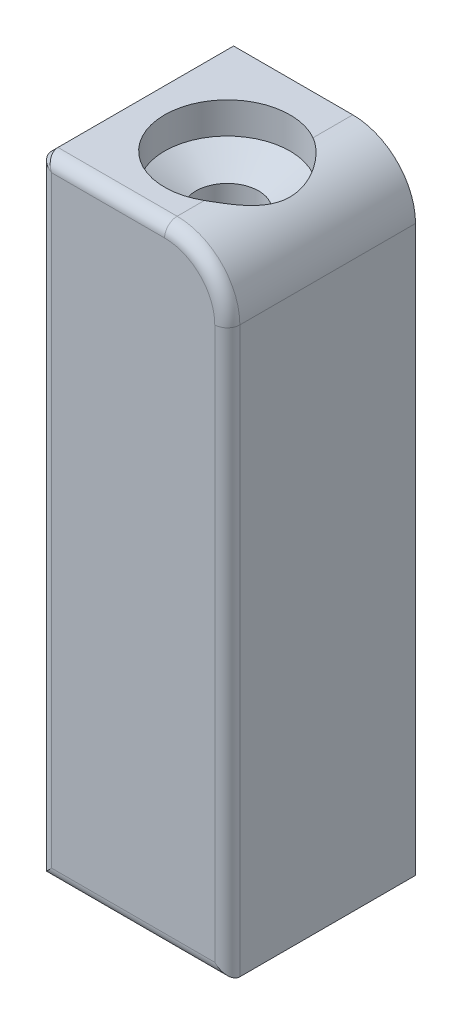
ISO-10303-21;
HEADER;
FILE_DESCRIPTION(('STEP AP214'),'2;1');
FILE_NAME('part.step','',(''),(''),'','','');
FILE_SCHEMA(('AUTOMOTIVE_DESIGN { 1 0 10303 214 1 1 1 1 }'));
ENDSEC;
DATA;
#1=APPLICATION_CONTEXT('core data for automotive mechanical design processes');
#2=APPLICATION_PROTOCOL_DEFINITION('international standard','automotive_design',2000,#1);
#3=PRODUCT_CONTEXT('',#1,'mechanical');
#4=PRODUCT('Part','Part','',(#3));
#5=PRODUCT_RELATED_PRODUCT_CATEGORY('part','',(#4));
#6=PRODUCT_DEFINITION_FORMATION('','',#4);
#7=PRODUCT_DEFINITION_CONTEXT('part definition',#1,'design');
#8=PRODUCT_DEFINITION('design','',#6,#7);
#9=PRODUCT_DEFINITION_SHAPE('','',#8);
#10=(LENGTH_UNIT() NAMED_UNIT(*) SI_UNIT(.MILLI.,.METRE.));
#11=(NAMED_UNIT(*) PLANE_ANGLE_UNIT() SI_UNIT($,.RADIAN.));
#12=(NAMED_UNIT(*) SI_UNIT($,.STERADIAN.) SOLID_ANGLE_UNIT());
#13=UNCERTAINTY_MEASURE_WITH_UNIT(LENGTH_MEASURE(1.E-05),#10,'distance_accuracy_value','');
#14=(GEOMETRIC_REPRESENTATION_CONTEXT(3) GLOBAL_UNCERTAINTY_ASSIGNED_CONTEXT((#13)) GLOBAL_UNIT_ASSIGNED_CONTEXT((#10,
#11,#12)) REPRESENTATION_CONTEXT('',''));
#15=CARTESIAN_POINT('',(0.,0.,0.));
#16=DIRECTION('',(0.,0.,1.));
#17=DIRECTION('',(1.,0.,0.));
#18=AXIS2_PLACEMENT_3D('',#15,#16,#17);
#19=CARTESIAN_POINT('',(15.,100.,-15.));
#20=DIRECTION('',(-1.,0.,0.));
#21=DIRECTION('',(0.,0.,1.));
#22=AXIS2_PLACEMENT_3D('',#19,#20,#21);
#23=PLANE('',#22);
#24=DIRECTION('',(0.,0.,-1.));
#25=VECTOR('',#24,1.);
#26=CARTESIAN_POINT('',(15.,90.,15.));
#27=LINE('',#26,#25);
#28=CARTESIAN_POINT('',(15.,90.,-15.));
#29=VERTEX_POINT('',#28);
#30=CARTESIAN_POINT('',(15.,90.,13.));
#31=VERTEX_POINT('',#30);
#32=EDGE_CURVE('E479',#29,#31,#27,.F.);
#33=ORIENTED_EDGE('',*,*,#32,.T.);
#34=DIRECTION('',(0.,-1.,0.));
#35=VECTOR('',#34,1.);
#36=CARTESIAN_POINT('',(15.,100.,13.));
#37=LINE('',#36,#35);
#38=CARTESIAN_POINT('',(15.,0.,13.));
#39=VERTEX_POINT('',#38);
#40=EDGE_CURVE('E125',#31,#39,#37,.T.);
#41=ORIENTED_EDGE('',*,*,#40,.T.);
#42=DIRECTION('',(0.,0.,-1.));
#43=VECTOR('',#42,1.);
#44=CARTESIAN_POINT('',(15.,0.,-15.));
#45=LINE('',#44,#43);
#46=CARTESIAN_POINT('',(15.,0.,-15.));
#47=VERTEX_POINT('',#46);
#48=EDGE_CURVE('E119',#39,#47,#45,.T.);
#49=ORIENTED_EDGE('',*,*,#48,.T.);
#50=DIRECTION('',(0.,-1.,0.));
#51=VECTOR('',#50,1.);
#52=CARTESIAN_POINT('',(15.,100.,-15.));
#53=LINE('',#52,#51);
#54=EDGE_CURVE('E122',#29,#47,#53,.T.);
#55=ORIENTED_EDGE('',*,*,#54,.F.);
#56=EDGE_LOOP('',(#33,#41,#49,#55));
#57=FACE_BOUND('',#56,.T.);
#58=ADVANCED_FACE('F41',(#57),#23,.F.);
#59=CARTESIAN_POINT('',(-15.,100.,-15.));
#60=DIRECTION('',(0.,0.,1.));
#61=DIRECTION('',(1.,0.,0.));
#62=AXIS2_PLACEMENT_3D('',#59,#60,#61);
#63=PLANE('',#62);
#64=DIRECTION('',(0.,-1.,0.));
#65=VECTOR('',#64,1.);
#66=CARTESIAN_POINT('',(-15.,100.,-15.));
#67=LINE('',#66,#65);
#68=CARTESIAN_POINT('',(-15.,99.,-15.));
#69=VERTEX_POINT('',#68);
#70=CARTESIAN_POINT('',(-15.,0.,-15.));
#71=VERTEX_POINT('',#70);
#72=EDGE_CURVE('E139',#69,#71,#67,.T.);
#73=ORIENTED_EDGE('',*,*,#72,.F.);
#74=DIRECTION('',(0.707106781186548,0.707106781186548,0.));
#75=VECTOR('',#74,1.);
#76=CARTESIAN_POINT('',(-14.,100.,-15.));
#77=LINE('',#76,#75);
#78=CARTESIAN_POINT('',(-14.,100.,-15.));
#79=VERTEX_POINT('',#78);
#80=EDGE_CURVE('E11',#69,#79,#77,.T.);
#81=ORIENTED_EDGE('',*,*,#80,.T.);
#82=DIRECTION('',(-1.,0.,0.));
#83=VECTOR('',#82,1.);
#84=CARTESIAN_POINT('',(-15.,100.,-15.));
#85=LINE('',#84,#83);
#86=CARTESIAN_POINT('',(4.99999999999998,100.,-15.));
#87=VERTEX_POINT('',#86);
#88=EDGE_CURVE('E145',#87,#79,#85,.T.);
#89=ORIENTED_EDGE('',*,*,#88,.F.);
#90=CARTESIAN_POINT('',(4.99999999999998,90.,-15.));
#91=DIRECTION('',(0.,0.,1.));
#92=DIRECTION('',(1.,0.,0.));
#93=AXIS2_PLACEMENT_3D('',#90,#91,#92);
#94=CIRCLE('',#93,10.);
#95=EDGE_CURVE('E137',#87,#29,#94,.F.);
#96=ORIENTED_EDGE('',*,*,#95,.T.);
#97=ORIENTED_EDGE('',*,*,#54,.T.);
#98=DIRECTION('',(-1.,0.,0.));
#99=VECTOR('',#98,1.);
#100=CARTESIAN_POINT('',(-15.,0.,-15.));
#101=LINE('',#100,#99);
#102=EDGE_CURVE('E130',#47,#71,#101,.T.);
#103=ORIENTED_EDGE('',*,*,#102,.T.);
#104=EDGE_LOOP('',(#73,#81,#89,#96,#97,#103));
#105=FACE_BOUND('',#104,.T.);
#106=ADVANCED_FACE('F134',(#105),#63,.F.);
#107=CARTESIAN_POINT('',(-15.,100.,-15.));
#108=DIRECTION('',(1.,0.,0.));
#109=DIRECTION('',(0.,0.,-1.));
#110=AXIS2_PLACEMENT_3D('',#107,#108,#109);
#111=PLANE('',#110);
#112=DIRECTION('',(0.,-1.,0.));
#113=VECTOR('',#112,1.);
#114=CARTESIAN_POINT('',(-15.,100.,13.));
#115=LINE('',#114,#113);
#116=CARTESIAN_POINT('',(-15.,0.,13.));
#117=VERTEX_POINT('',#116);
#118=CARTESIAN_POINT('',(-15.,99.,13.));
#119=VERTEX_POINT('',#118);
#120=EDGE_CURVE('E423',#117,#119,#115,.F.);
#121=ORIENTED_EDGE('',*,*,#120,.T.);
#122=DIRECTION('',(0.,0.,-1.));
#123=VECTOR('',#122,1.);
#124=CARTESIAN_POINT('',(-15.,99.,-15.));
#125=LINE('',#124,#123);
#126=EDGE_CURVE('E53',#119,#69,#125,.T.);
#127=ORIENTED_EDGE('',*,*,#126,.T.);
#128=ORIENTED_EDGE('',*,*,#72,.T.);
#129=DIRECTION('',(0.,0.,1.));
#130=VECTOR('',#129,1.);
#131=CARTESIAN_POINT('',(-15.,0.,-15.));
#132=LINE('',#131,#130);
#133=EDGE_CURVE('E143',#71,#117,#132,.T.);
#134=ORIENTED_EDGE('',*,*,#133,.T.);
#135=EDGE_LOOP('',(#121,#127,#128,#134));
#136=FACE_BOUND('',#135,.T.);
#137=ADVANCED_FACE('F187',(#136),#111,.F.);
#138=CARTESIAN_POINT('',(-15.,100.,15.));
#139=DIRECTION('',(0.,0.,-1.));
#140=DIRECTION('',(-1.,0.,0.));
#141=AXIS2_PLACEMENT_3D('',#138,#139,#140);
#142=PLANE('',#141);
#143=DIRECTION('',(0.,-1.,0.));
#144=VECTOR('',#143,1.);
#145=CARTESIAN_POINT('',(-13.,100.,15.));
#146=LINE('',#145,#144);
#147=CARTESIAN_POINT('',(-13.,98.,15.));
#148=VERTEX_POINT('',#147);
#149=CARTESIAN_POINT('',(-13.,2.,15.));
#150=VERTEX_POINT('',#149);
#151=EDGE_CURVE('E462',#148,#150,#146,.T.);
#152=ORIENTED_EDGE('',*,*,#151,.T.);
#153=DIRECTION('',(1.,0.,0.));
#154=VECTOR('',#153,1.);
#155=CARTESIAN_POINT('',(-15.,2.,15.));
#156=LINE('',#155,#154);
#157=CARTESIAN_POINT('',(13.,2.,15.));
#158=VERTEX_POINT('',#157);
#159=EDGE_CURVE('E464',#150,#158,#156,.T.);
#160=ORIENTED_EDGE('',*,*,#159,.T.);
#161=DIRECTION('',(0.,-1.,0.));
#162=VECTOR('',#161,1.);
#163=CARTESIAN_POINT('',(13.,100.,15.));
#164=LINE('',#163,#162);
#165=CARTESIAN_POINT('',(13.,90.,15.));
#166=VERTEX_POINT('',#165);
#167=EDGE_CURVE('E477',#158,#166,#164,.F.);
#168=ORIENTED_EDGE('',*,*,#167,.T.);
#169=CARTESIAN_POINT('',(4.99999999999999,90.,15.));
#170=DIRECTION('',(0.,0.,-1.));
#171=DIRECTION('',(-1.,0.,0.));
#172=AXIS2_PLACEMENT_3D('',#169,#170,#171);
#173=CIRCLE('',#172,8.);
#174=CARTESIAN_POINT('',(4.99999999999999,98.,15.));
#175=VERTEX_POINT('',#174);
#176=EDGE_CURVE('E465',#166,#175,#173,.F.);
#177=ORIENTED_EDGE('',*,*,#176,.T.);
#178=DIRECTION('',(1.,0.,0.));
#179=VECTOR('',#178,1.);
#180=CARTESIAN_POINT('',(-15.,98.,15.));
#181=LINE('',#180,#179);
#182=EDGE_CURVE('E456',#175,#148,#181,.F.);
#183=ORIENTED_EDGE('',*,*,#182,.T.);
#184=EDGE_LOOP('',(#152,#160,#168,#177,#183));
#185=FACE_BOUND('',#184,.T.);
#186=ADVANCED_FACE('F180',(#185),#142,.F.);
#187=CARTESIAN_POINT('',(0.,100.,0.));
#188=DIRECTION('',(0.,1.,0.));
#189=DIRECTION('',(0.,0.,1.));
#190=AXIS2_PLACEMENT_3D('',#187,#188,#189);
#191=PLANE('',#190);
#192=ORIENTED_EDGE('',*,*,#88,.T.);
#193=DIRECTION('',(0.,0.,1.));
#194=VECTOR('',#193,1.);
#195=CARTESIAN_POINT('',(-14.,100.,13.));
#196=LINE('',#195,#194);
#197=CARTESIAN_POINT('',(-14.,100.,13.));
#198=VERTEX_POINT('',#197);
#199=EDGE_CURVE('E397',#79,#198,#196,.T.);
#200=ORIENTED_EDGE('',*,*,#199,.T.);
#201=DIRECTION('',(1.,0.,0.));
#202=VECTOR('',#201,1.);
#203=CARTESIAN_POINT('',(4.99999999999998,100.,13.));
#204=LINE('',#203,#202);
#205=CARTESIAN_POINT('',(4.99999999999998,100.,13.));
#206=VERTEX_POINT('',#205);
#207=EDGE_CURVE('E426',#198,#206,#204,.T.);
#208=ORIENTED_EDGE('',*,*,#207,.T.);
#209=DIRECTION('',(0.,0.,-1.));
#210=VECTOR('',#209,1.);
#211=CARTESIAN_POINT('',(4.99999999999998,100.,-15.));
#212=LINE('',#211,#210);
#213=CARTESIAN_POINT('',(4.99999999999998,100.,8.66025403784441));
#214=VERTEX_POINT('',#213);
#215=EDGE_CURVE('E151',#206,#214,#212,.T.);
#216=ORIENTED_EDGE('',*,*,#215,.T.);
#217=CARTESIAN_POINT('',(0.,100.,0.));
#218=DIRECTION('',(0.,1.,0.));
#219=DIRECTION('',(-1.,0.,0.));
#220=AXIS2_PLACEMENT_3D('',#217,#218,#219);
#221=CIRCLE('',#220,10.);
#222=CARTESIAN_POINT('',(4.99999999999998,100.,-8.66025403784441));
#223=VERTEX_POINT('',#222);
#224=EDGE_CURVE('E485',#223,#214,#221,.T.);
#225=ORIENTED_EDGE('',*,*,#224,.F.);
#226=DIRECTION('',(0.,0.,-1.));
#227=VECTOR('',#226,1.);
#228=CARTESIAN_POINT('',(4.99999999999998,100.,-15.));
#229=LINE('',#228,#227);
#230=EDGE_CURVE('E138',#223,#87,#229,.T.);
#231=ORIENTED_EDGE('',*,*,#230,.T.);
#232=EDGE_LOOP('',(#192,#200,#208,#216,#225,#231));
#233=FACE_BOUND('',#232,.T.);
#234=ADVANCED_FACE('F177',(#233),#191,.T.);
#235=CARTESIAN_POINT('',(0.,0.,0.));
#236=DIRECTION('',(0.,1.,0.));
#237=DIRECTION('',(0.,0.,1.));
#238=AXIS2_PLACEMENT_3D('',#235,#236,#237);
#239=PLANE('',#238);
#240=CARTESIAN_POINT('',(0.,0.,0.));
#241=DIRECTION('',(0.,1.,0.));
#242=DIRECTION('',(-1.,0.,0.));
#243=AXIS2_PLACEMENT_3D('',#240,#241,#242);
#244=CIRCLE('',#243,5.);
#245=CARTESIAN_POINT('',(-5.,0.,0.));
#246=VERTEX_POINT('',#245);
#247=EDGE_CURVE('E490',#246,#246,#244,.T.);
#248=ORIENTED_EDGE('',*,*,#247,.T.);
#249=EDGE_LOOP('',(#248));
#250=FACE_BOUND('',#249,.T.);
#251=ORIENTED_EDGE('',*,*,#48,.F.);
#252=DIRECTION('',(1.,0.,0.));
#253=VECTOR('',#252,1.);
#254=CARTESIAN_POINT('',(0.,0.,13.));
#255=LINE('',#254,#253);
#256=EDGE_CURVE('E427',#39,#117,#255,.F.);
#257=ORIENTED_EDGE('',*,*,#256,.T.);
#258=ORIENTED_EDGE('',*,*,#133,.F.);
#259=ORIENTED_EDGE('',*,*,#102,.F.);
#260=EDGE_LOOP('',(#251,#257,#258,#259));
#261=FACE_BOUND('',#260,.T.);
#262=ADVANCED_FACE('F141',(#250,#261),#239,.F.);
#263=CARTESIAN_POINT('',(0.,95.,0.));
#264=DIRECTION('',(0.,1.,0.));
#265=DIRECTION('',(-1.,0.,0.));
#266=AXIS2_PLACEMENT_3D('',#263,#264,#265);
#267=CONICAL_SURFACE('',#266,10.,1.03037682652431);
#268=CARTESIAN_POINT('',(0.,92.,0.));
#269=DIRECTION('',(0.,1.,0.));
#270=DIRECTION('',(-1.,0.,0.));
#271=AXIS2_PLACEMENT_3D('',#268,#269,#270);
#272=CIRCLE('',#271,5.00000000000002);
#273=CARTESIAN_POINT('',(-5.00000000000001,92.,0.));
#274=VERTEX_POINT('',#273);
#275=EDGE_CURVE('E422',#274,#274,#272,.T.);
#276=ORIENTED_EDGE('',*,*,#275,.F.);
#277=EDGE_LOOP('',(#276));
#278=FACE_BOUND('',#277,.T.);
#279=CARTESIAN_POINT('',(0.,95.,0.));
#280=DIRECTION('',(0.,1.,0.));
#281=DIRECTION('',(-1.,0.,0.));
#282=AXIS2_PLACEMENT_3D('',#279,#280,#281);
#283=CIRCLE('',#282,10.);
#284=CARTESIAN_POINT('',(-10.,95.,0.));
#285=VERTEX_POINT('',#284);
#286=EDGE_CURVE('E131',#285,#285,#283,.T.);
#287=ORIENTED_EDGE('',*,*,#286,.T.);
#288=EDGE_LOOP('',(#287));
#289=FACE_BOUND('',#288,.T.);
#290=ADVANCED_FACE('F172',(#278,#289),#267,.F.);
#291=CARTESIAN_POINT('',(0.,100.,0.));
#292=DIRECTION('',(0.,1.,0.));
#293=DIRECTION('',(-1.,0.,0.));
#294=AXIS2_PLACEMENT_3D('',#291,#292,#293);
#295=CYLINDRICAL_SURFACE('',#294,10.);
#296=ORIENTED_EDGE('',*,*,#286,.F.);
#297=EDGE_LOOP('',(#296));
#298=FACE_BOUND('',#297,.T.);
#299=ORIENTED_EDGE('',*,*,#224,.T.);
#300=CARTESIAN_POINT('',(4.99999999999998,100.,8.66025403784441));
#301=CARTESIAN_POINT('',(5.1157847617349,100.000001131384,8.59340770325739));
#302=CARTESIAN_POINT('',(5.23020292316196,99.9979888190166,8.52424974641227));
#303=CARTESIAN_POINT('',(5.45606768468489,99.9902335295261,8.38147770015708));
#304=CARTESIAN_POINT('',(5.56751481413062,99.9844912216656,8.3078644123024));
#305=CARTESIAN_POINT('',(5.89677376253705,99.9621347310108,8.0807825405781));
#306=CARTESIAN_POINT('',(6.10985226502428,99.9403891919175,7.92087018657229));
#307=CARTESIAN_POINT('',(6.52044419689959,99.8858949183849,7.58640594918575));
#308=CARTESIAN_POINT('',(6.71804287023707,99.8532125743411,7.41194705491462));
#309=CARTESIAN_POINT('',(7.09810833049906,99.7793366749759,7.04882629932156));
#310=CARTESIAN_POINT('',(7.2805702288729,99.7381403848837,6.86015988680014));
#311=CARTESIAN_POINT('',(7.62867405247709,99.6499828147957,6.47079792907863));
#312=CARTESIAN_POINT('',(7.79438967406406,99.6030490007045,6.27016187864535));
#313=CARTESIAN_POINT('',(8.10932026663552,99.5057502535126,5.857163058129));
#314=CARTESIAN_POINT('',(8.25853673558549,99.4553856325683,5.64480135525235));
#315=CARTESIAN_POINT('',(8.54025563973519,99.3535596427269,5.20879597875866));
#316=CARTESIAN_POINT('',(8.67271864079273,99.3020960076783,4.9851273601103));
#317=CARTESIAN_POINT('',(8.91995935958421,99.2006400274143,4.52789953857463));
#318=CARTESIAN_POINT('',(9.03473697064616,99.1506476910749,4.29434027604131));
#319=CARTESIAN_POINT('',(9.25630173500699,99.0498689880536,3.79506916923658));
#320=CARTESIAN_POINT('',(9.36121887378862,98.999480395954,3.52844265054109));
#321=CARTESIAN_POINT('',(9.54812240268773,98.90648615213,2.98591169112969));
#322=CARTESIAN_POINT('',(9.63010770625217,98.8638808692264,2.71000681148139));
#323=CARTESIAN_POINT('',(9.77009554933528,98.789339197022,2.15128046458504));
#324=CARTESIAN_POINT('',(9.82814181448298,98.7573833767283,1.86847261607247));
#325=CARTESIAN_POINT('',(9.91964082825276,98.70631421565,1.29776816872455));
#326=CARTESIAN_POINT('',(9.95309750186943,98.6871988253157,1.00987238954154));
#327=CARTESIAN_POINT('',(9.99306158824259,98.6642831559371,0.456883357037627));
#328=CARTESIAN_POINT('',(10.001663283863,98.6592934835499,0.191989159197279));
#329=CARTESIAN_POINT('',(9.99780673317881,98.66152056796,-0.337588054738066));
#330=CARTESIAN_POINT('',(9.98534948199223,98.6687367479829,-0.602271080220493));
#331=CARTESIAN_POINT('',(9.93955041048055,98.6949138508275,-1.12930747356491));
#332=CARTESIAN_POINT('',(9.90620191351537,98.7138785283339,-1.39166006944896));
#333=CARTESIAN_POINT('',(9.81906717115499,98.7623665274928,-1.91193789913399));
#334=CARTESIAN_POINT('',(9.76528064316076,98.7918899951425,-2.16986307166493));
#335=CARTESIAN_POINT('',(9.64204837375324,98.8575345196506,-2.66292858876468));
#336=CARTESIAN_POINT('',(9.57385377334035,98.8930992117,-2.89845732958416));
#337=CARTESIAN_POINT('',(9.42071897228569,98.9702056652107,-3.36302861809651));
#338=CARTESIAN_POINT('',(9.33577199617164,99.0117498432231,-3.5920684983724));
#339=CARTESIAN_POINT('',(9.05643124912414,99.1426308123298,-4.26834696316746));
#340=CARTESIAN_POINT('',(8.83756471550967,99.2382002418032,-4.70463702300606));
#341=CARTESIAN_POINT('',(8.44694666244557,99.3883721711567,-5.35963007603239));
#342=CARTESIAN_POINT('',(8.29564955352371,99.4428478659034,-5.59095073306422));
#343=CARTESIAN_POINT('',(7.97401311628579,99.5490275024394,-6.04081940646357));
#344=CARTESIAN_POINT('',(7.80367006245982,99.6007308990126,-6.25936491115278));
#345=CARTESIAN_POINT('',(7.44513003763254,99.6982353354248,-6.68181339094215));
#346=CARTESIAN_POINT('',(7.25697506994624,99.7440496887803,-6.88574891569769));
#347=CARTESIAN_POINT('',(6.86346277051817,99.8268979634797,-7.27805125273657));
#348=CARTESIAN_POINT('',(6.65811404531407,99.8639362426494,-7.46642576156252));
#349=CARTESIAN_POINT('',(6.22047032576602,99.9278263118668,-7.83528181750165));
#350=CARTESIAN_POINT('',(5.98733861949266,99.9540700873702,-8.01488602977286));
#351=CARTESIAN_POINT('',(5.62573196108613,99.9811380019926,-8.26879101048299));
#352=CARTESIAN_POINT('',(5.50311811868751,99.9881116016983,-8.35089646293084));
#353=CARTESIAN_POINT('',(5.25422791627709,99.9975439288864,-8.50969386740612));
#354=CARTESIAN_POINT('',(5.12795072650994,100.000001625268,-8.5863845792621));
#355=CARTESIAN_POINT('',(4.99999999999998,100.,-8.66025403784441));
#356=B_SPLINE_CURVE_WITH_KNOTS('',3,(#300,#301,#302,#303,#304,#305,#306,#307,#308,#309,#310,
#311,#312,#313,#314,#315,#316,#317,#318,#319,#320,#321,#322,#323,#324,#325,#326,#327,#328,#329,
#330,#331,#332,#333,#334,#335,#336,#337,#338,#339,#340,#341,#342,#343,#344,#345,#346,#347,#348,
#349,#350,#351,#352,#353,#354,#355),.UNSPECIFIED.,.F.,.F.,(4,2,2,2,2,2,2,2,2,2,2,2,2,2,2,2,2,2,
2,2,2,2,2,2,2,2,2,4),(0.,0.400994849668489,0.801917769861819,1.60255898057859,2.39842560324181,
3.19454826522846,3.9869990146707,4.77937775797566,5.57358819332141,6.36780341887406,
7.23945045067124,8.11113877573381,8.98122779859984,9.85117790753413,10.6453216557964,
11.439427878692,12.2337880198186,13.0281591450546,13.7706843207104,14.5135104277036,
15.9994949202635,16.8439283220262,17.6885271903491,18.5311817506105,19.373417003391,
20.2581331190523,20.7011354818943,21.144238981354),.UNSPECIFIED.);
#357=EDGE_CURVE('E153',#214,#223,#356,.T.);
#358=ORIENTED_EDGE('',*,*,#357,.T.);
#359=EDGE_LOOP('',(#299,#358));
#360=FACE_BOUND('',#359,.T.);
#361=ADVANCED_FACE('F166',(#298,#360),#295,.F.);
#362=CARTESIAN_POINT('',(0.,100.,0.));
#363=DIRECTION('',(0.,1.,0.));
#364=DIRECTION('',(-1.,0.,0.));
#365=AXIS2_PLACEMENT_3D('',#362,#363,#364);
#366=CYLINDRICAL_SURFACE('',#365,5.00000000000001);
#367=ORIENTED_EDGE('',*,*,#247,.F.);
#368=EDGE_LOOP('',(#367));
#369=FACE_BOUND('',#368,.T.);
#370=ORIENTED_EDGE('',*,*,#275,.T.);
#371=EDGE_LOOP('',(#370));
#372=FACE_BOUND('',#371,.T.);
#373=ADVANCED_FACE('F171',(#369,#372),#366,.F.);
#374=CARTESIAN_POINT('',(4.99999999999998,90.,0.));
#375=DIRECTION('',(0.,0.,1.));
#376=DIRECTION('',(1.,0.,0.));
#377=AXIS2_PLACEMENT_3D('',#374,#375,#376);
#378=CYLINDRICAL_SURFACE('',#377,10.);
#379=ORIENTED_EDGE('',*,*,#215,.F.);
#380=CARTESIAN_POINT('',(4.99999999999998,90.,13.));
#381=DIRECTION('',(0.,0.,-1.));
#382=DIRECTION('',(-1.,0.,0.));
#383=AXIS2_PLACEMENT_3D('',#380,#381,#382);
#384=CIRCLE('',#383,10.);
#385=EDGE_CURVE('E434',#206,#31,#384,.T.);
#386=ORIENTED_EDGE('',*,*,#385,.T.);
#387=ORIENTED_EDGE('',*,*,#32,.F.);
#388=ORIENTED_EDGE('',*,*,#95,.F.);
#389=ORIENTED_EDGE('',*,*,#230,.F.);
#390=ORIENTED_EDGE('',*,*,#357,.F.);
#391=EDGE_LOOP('',(#379,#386,#387,#388,#389,#390));
#392=FACE_BOUND('',#391,.T.);
#393=ADVANCED_FACE('F162',(#392),#378,.T.);
#394=CARTESIAN_POINT('',(0.,98.,13.));
#395=DIRECTION('',(-1.,0.,0.));
#396=DIRECTION('',(0.,0.,1.));
#397=AXIS2_PLACEMENT_3D('',#394,#395,#396);
#398=CYLINDRICAL_SURFACE('',#397,2.);
#399=ORIENTED_EDGE('',*,*,#207,.F.);
#400=CARTESIAN_POINT('',(-13.,98.,15.));
#401=CARTESIAN_POINT('',(-13.065450212761,98.1309004255219,15.0000088191294));
#402=CARTESIAN_POINT('',(-13.1308977166226,98.2617954332451,14.9871079670207));
#403=CARTESIAN_POINT('',(-13.2592829274097,98.5185658548194,14.9360331545922));
#404=CARTESIAN_POINT('',(-13.3222153202802,98.6444306405604,14.8978524892559));
#405=CARTESIAN_POINT('',(-13.44315154445,98.8863030889,14.7976656407892));
#406=CARTESIAN_POINT('',(-13.5011503698779,99.0023007397558,14.7356636046647));
#407=CARTESIAN_POINT('',(-13.6099900961613,99.2199801923227,14.5902148445455));
#408=CARTESIAN_POINT('',(-13.6608264918094,99.3216529836188,14.5067741411274));
#409=CARTESIAN_POINT('',(-13.7533870705637,99.5067741411274,14.3216529836188));
#410=CARTESIAN_POINT('',(-13.7951074222588,99.5902148445176,14.2199801923643));
#411=CARTESIAN_POINT('',(-13.8678318023463,99.7356636046925,14.0023007397141));
#412=CARTESIAN_POINT('',(-13.8988328203768,99.7976656407535,13.8863030889862));
#413=CARTESIAN_POINT('',(-13.9489262446458,99.8978524892916,13.6444306404741));
#414=CARTESIAN_POINT('',(-13.9680165772841,99.9360331545682,13.5185658549401));
#415=CARTESIAN_POINT('',(-13.9935539835223,99.9871079670447,13.2617954331244));
#416=CARTESIAN_POINT('',(-14.0000044095647,100.000008819129,13.130900425522));
#417=CARTESIAN_POINT('',(-14.,100.,13.));
#418=B_SPLINE_CURVE_WITH_KNOTS('',3,(#400,#401,#402,#403,#404,#405,#406,#407,#408,#409,#410,
#411,#412,#413,#414,#415,#416,#417),.UNSPECIFIED.,.F.,.F.,(4,2,2,2,2,2,2,2,4),(1.5707963267949,
1.76714586764426,1.96349540849362,2.15984494934298,2.35619449019234,2.55254403104171,
2.74889357189107,2.94524311274043,3.14159265358979),.UNSPECIFIED.);
#419=EDGE_CURVE('E388',#198,#148,#418,.F.);
#420=ORIENTED_EDGE('',*,*,#419,.T.);
#421=ORIENTED_EDGE('',*,*,#182,.F.);
#422=CARTESIAN_POINT('',(4.99999999999998,98.,13.));
#423=DIRECTION('',(1.,0.,0.));
#424=DIRECTION('',(0.,0.,-1.));
#425=AXIS2_PLACEMENT_3D('',#422,#423,#424);
#426=CIRCLE('',#425,2.);
#427=EDGE_CURVE('E419',#206,#175,#426,.T.);
#428=ORIENTED_EDGE('',*,*,#427,.F.);
#429=EDGE_LOOP('',(#399,#420,#421,#428));
#430=FACE_BOUND('',#429,.T.);
#431=ADVANCED_FACE('F237',(#430),#398,.T.);
#432=CARTESIAN_POINT('',(4.99999999999998,90.,13.));
#433=DIRECTION('',(0.,0.,-1.));
#434=DIRECTION('',(-1.,0.,0.));
#435=AXIS2_PLACEMENT_3D('',#432,#433,#434);
#436=TOROIDAL_SURFACE('',#435,8.,2.);
#437=ORIENTED_EDGE('',*,*,#427,.T.);
#438=ORIENTED_EDGE('',*,*,#176,.F.);
#439=CARTESIAN_POINT('',(13.,90.,13.));
#440=DIRECTION('',(0.,-1.,0.));
#441=DIRECTION('',(0.,0.,-1.));
#442=AXIS2_PLACEMENT_3D('',#439,#440,#441);
#443=CIRCLE('',#442,2.);
#444=EDGE_CURVE('E412',#31,#166,#443,.T.);
#445=ORIENTED_EDGE('',*,*,#444,.F.);
#446=ORIENTED_EDGE('',*,*,#385,.F.);
#447=EDGE_LOOP('',(#437,#438,#445,#446));
#448=FACE_BOUND('',#447,.T.);
#449=ADVANCED_FACE('F244',(#448),#436,.T.);
#450=CARTESIAN_POINT('',(-13.,100.,13.));
#451=DIRECTION('',(0.,-1.,0.));
#452=DIRECTION('',(0.,0.,-1.));
#453=AXIS2_PLACEMENT_3D('',#450,#451,#452);
#454=CYLINDRICAL_SURFACE('',#453,2.);
#455=ORIENTED_EDGE('',*,*,#151,.F.);
#456=CARTESIAN_POINT('',(-15.,99.,13.));
#457=CARTESIAN_POINT('',(-15.0000088191294,99.0000044095646,13.130900425522));
#458=CARTESIAN_POINT('',(-14.9871079670447,98.9935539835223,13.2617954331244));
#459=CARTESIAN_POINT('',(-14.9360331545683,98.9680165772841,13.5185658549401));
#460=CARTESIAN_POINT('',(-14.8978524892916,98.9489262446458,13.6444306404741));
#461=CARTESIAN_POINT('',(-14.7976656407535,98.8988328203768,13.8863030889862));
#462=CARTESIAN_POINT('',(-14.7356636046925,98.8678318023462,14.0023007397141));
#463=CARTESIAN_POINT('',(-14.5902148445177,98.7951074222588,14.2199801923643));
#464=CARTESIAN_POINT('',(-14.5067741411274,98.7533870705637,14.3216529836188));
#465=CARTESIAN_POINT('',(-14.3216529836188,98.6608264918094,14.5067741411274));
#466=CARTESIAN_POINT('',(-14.2199801923227,98.6099900961613,14.5902148445455));
#467=CARTESIAN_POINT('',(-14.0023007397557,98.5011503698779,14.7356636046647));
#468=CARTESIAN_POINT('',(-13.8863030889,98.44315154445,14.7976656407892));
#469=CARTESIAN_POINT('',(-13.6444306405604,98.3222153202802,14.8978524892559));
#470=CARTESIAN_POINT('',(-13.5185658548194,98.2592829274097,14.9360331545922));
#471=CARTESIAN_POINT('',(-13.2617954332451,98.1308977166226,14.9871079670207));
#472=CARTESIAN_POINT('',(-13.130900425522,98.065450212761,15.0000088191294));
#473=CARTESIAN_POINT('',(-13.,98.,15.));
#474=B_SPLINE_CURVE_WITH_KNOTS('',3,(#456,#457,#458,#459,#460,#461,#462,#463,#464,#465,#466,
#467,#468,#469,#470,#471,#472,#473),.UNSPECIFIED.,.F.,.F.,(4,2,2,2,2,2,2,2,4),(1.5707963267949,
1.76714586764426,1.96349540849362,2.15984494934298,2.35619449019234,2.55254403104171,
2.74889357189107,2.94524311274043,3.14159265358979),.UNSPECIFIED.);
#475=EDGE_CURVE('E392',#148,#119,#474,.F.);
#476=ORIENTED_EDGE('',*,*,#475,.T.);
#477=ORIENTED_EDGE('',*,*,#120,.F.);
#478=CARTESIAN_POINT('',(-13.,2.,13.));
#479=DIRECTION('',(0.707106781186547,-0.707106781186547,0.));
#480=DIRECTION('',(-0.707106781186547,-0.707106781186547,0.));
#481=AXIS2_PLACEMENT_3D('',#478,#479,#480);
#482=ELLIPSE('',#481,2.82842712474619,2.);
#483=EDGE_CURVE('E407',#150,#117,#482,.T.);
#484=ORIENTED_EDGE('',*,*,#483,.F.);
#485=EDGE_LOOP('',(#455,#476,#477,#484));
#486=FACE_BOUND('',#485,.T.);
#487=ADVANCED_FACE('F252',(#486),#454,.T.);
#488=CARTESIAN_POINT('',(13.,100.,13.));
#489=DIRECTION('',(0.,-1.,0.));
#490=DIRECTION('',(0.,0.,-1.));
#491=AXIS2_PLACEMENT_3D('',#488,#489,#490);
#492=CYLINDRICAL_SURFACE('',#491,2.);
#493=ORIENTED_EDGE('',*,*,#444,.T.);
#494=ORIENTED_EDGE('',*,*,#167,.F.);
#495=CARTESIAN_POINT('',(13.,2.,13.));
#496=DIRECTION('',(-0.707106781186547,-0.707106781186547,0.));
#497=DIRECTION('',(0.707106781186547,-0.707106781186547,0.));
#498=AXIS2_PLACEMENT_3D('',#495,#496,#497);
#499=ELLIPSE('',#498,2.82842712474619,2.);
#500=EDGE_CURVE('E399',#39,#158,#499,.T.);
#501=ORIENTED_EDGE('',*,*,#500,.F.);
#502=ORIENTED_EDGE('',*,*,#40,.F.);
#503=EDGE_LOOP('',(#493,#494,#501,#502));
#504=FACE_BOUND('',#503,.T.);
#505=ADVANCED_FACE('F260',(#504),#492,.T.);
#506=CARTESIAN_POINT('',(-15.,2.,13.));
#507=DIRECTION('',(1.,0.,0.));
#508=DIRECTION('',(0.,0.,-1.));
#509=AXIS2_PLACEMENT_3D('',#506,#507,#508);
#510=CYLINDRICAL_SURFACE('',#509,2.);
#511=ORIENTED_EDGE('',*,*,#483,.T.);
#512=ORIENTED_EDGE('',*,*,#256,.F.);
#513=ORIENTED_EDGE('',*,*,#500,.T.);
#514=ORIENTED_EDGE('',*,*,#159,.F.);
#515=EDGE_LOOP('',(#511,#512,#513,#514));
#516=FACE_BOUND('',#515,.T.);
#517=ADVANCED_FACE('F268',(#516),#510,.T.);
#518=CARTESIAN_POINT('',(-14.,100.,0.));
#519=DIRECTION('',(-0.707106781186547,0.707106781186547,0.));
#520=DIRECTION('',(0.,0.,-1.));
#521=AXIS2_PLACEMENT_3D('',#518,#519,#520);
#522=PLANE('',#521);
#523=ORIENTED_EDGE('',*,*,#80,.F.);
#524=ORIENTED_EDGE('',*,*,#126,.F.);
#525=CARTESIAN_POINT('',(-14.,100.,13.));
#526=CARTESIAN_POINT('',(-15.,99.,13.));
#527=B_SPLINE_CURVE_WITH_KNOTS('',1,(#525,#526),.UNSPECIFIED.,.F.,.F.,(2,2),(0.,1.),.UNSPECIFIED.);
#528=EDGE_CURVE('E390',#198,#119,#527,.T.);
#529=ORIENTED_EDGE('',*,*,#528,.F.);
#530=ORIENTED_EDGE('',*,*,#199,.F.);
#531=EDGE_LOOP('',(#523,#524,#529,#530));
#532=FACE_BOUND('',#531,.T.);
#533=ADVANCED_FACE('F44',(#532),#522,.T.);
#534=CARTESIAN_POINT('',(-13.,98.,15.));
#535=CARTESIAN_POINT('',(-13.130900425522,98.065450212761,15.0000088191294));
#536=CARTESIAN_POINT('',(-13.2617954332451,98.1308977166226,14.9871079670207));
#537=CARTESIAN_POINT('',(-13.5185658548194,98.2592829274097,14.9360331545922));
#538=CARTESIAN_POINT('',(-13.6444306405604,98.3222153202802,14.8978524892559));
#539=CARTESIAN_POINT('',(-13.8863030889,98.44315154445,14.7976656407892));
#540=CARTESIAN_POINT('',(-14.0023007397557,98.5011503698779,14.7356636046647));
#541=CARTESIAN_POINT('',(-14.2199801923227,98.6099900961613,14.5902148445455));
#542=CARTESIAN_POINT('',(-14.3216529836188,98.6608264918094,14.5067741411274));
#543=CARTESIAN_POINT('',(-14.5067741411274,98.7533870705637,14.3216529836188));
#544=CARTESIAN_POINT('',(-14.5902148445177,98.7951074222588,14.2199801923643));
#545=CARTESIAN_POINT('',(-14.7356636046925,98.8678318023462,14.0023007397141));
#546=CARTESIAN_POINT('',(-14.7976656407535,98.8988328203768,13.8863030889862));
#547=CARTESIAN_POINT('',(-14.8978524892916,98.9489262446458,13.6444306404741));
#548=CARTESIAN_POINT('',(-14.9360331545683,98.9680165772841,13.5185658549401));
#549=CARTESIAN_POINT('',(-14.9871079670447,98.9935539835223,13.2617954331244));
#550=CARTESIAN_POINT('',(-15.0000088191294,99.0000044095646,13.130900425522));
#551=CARTESIAN_POINT('',(-15.,99.,13.));
#552=CARTESIAN_POINT('',(-13.,98.,15.));
#553=CARTESIAN_POINT('',(-13.065450212761,98.1309004255219,15.0000088191294));
#554=CARTESIAN_POINT('',(-13.1308977166226,98.2617954332451,14.9871079670207));
#555=CARTESIAN_POINT('',(-13.2592829274097,98.5185658548194,14.9360331545922));
#556=CARTESIAN_POINT('',(-13.3222153202802,98.6444306405604,14.8978524892559));
#557=CARTESIAN_POINT('',(-13.44315154445,98.8863030889,14.7976656407892));
#558=CARTESIAN_POINT('',(-13.5011503698779,99.0023007397558,14.7356636046647));
#559=CARTESIAN_POINT('',(-13.6099900961613,99.2199801923227,14.5902148445455));
#560=CARTESIAN_POINT('',(-13.6608264918094,99.3216529836188,14.5067741411274));
#561=CARTESIAN_POINT('',(-13.7533870705637,99.5067741411274,14.3216529836188));
#562=CARTESIAN_POINT('',(-13.7951074222588,99.5902148445176,14.2199801923643));
#563=CARTESIAN_POINT('',(-13.8678318023463,99.7356636046925,14.0023007397141));
#564=CARTESIAN_POINT('',(-13.8988328203768,99.7976656407535,13.8863030889862));
#565=CARTESIAN_POINT('',(-13.9489262446458,99.8978524892916,13.6444306404741));
#566=CARTESIAN_POINT('',(-13.9680165772841,99.9360331545682,13.5185658549401));
#567=CARTESIAN_POINT('',(-13.9935539835223,99.9871079670447,13.2617954331244));
#568=CARTESIAN_POINT('',(-14.0000044095647,100.000008819129,13.130900425522));
#569=CARTESIAN_POINT('',(-14.,100.,13.));
#570=B_SPLINE_SURFACE_WITH_KNOTS('',1,3,((#534,#535,#536,#537,#538,#539,#540,#541,#542,#543,
#544,#545,#546,#547,#548,#549,#550,#551),(#552,#553,#554,#555,#556,#557,#558,#559,#560,#561,
#562,#563,#564,#565,#566,#567,#568,#569)),.UNSPECIFIED.,.F.,.F.,.F.,(2,2),(4,2,2,2,2,2,2,2,4),
(0.,1.),(1.5707963267949,1.76714586764426,1.96349540849362,2.15984494934298,2.35619449019234,
2.55254403104171,2.74889357189107,2.94524311274043,3.14159265358979),.UNSPECIFIED.);
#571=ORIENTED_EDGE('',*,*,#475,.F.);
#572=ORIENTED_EDGE('',*,*,#419,.F.);
#573=ORIENTED_EDGE('',*,*,#528,.T.);
#574=EDGE_LOOP('',(#571,#572,#573));
#575=FACE_BOUND('',#574,.T.);
#576=ADVANCED_FACE('F280',(#575),#570,.T.);
#577=CLOSED_SHELL('',(#58,#106,#137,#186,#234,#262,#290,#361,#373,#393,#431,#449,#487,#505,#517,
#533,#576));
#578=MANIFOLD_SOLID_BREP('B2',#577);
#579=ADVANCED_BREP_SHAPE_REPRESENTATION('',(#18,#578),#14);
#580=SHAPE_DEFINITION_REPRESENTATION(#9,#579);
ENDSEC;
END-ISO-10303-21;
